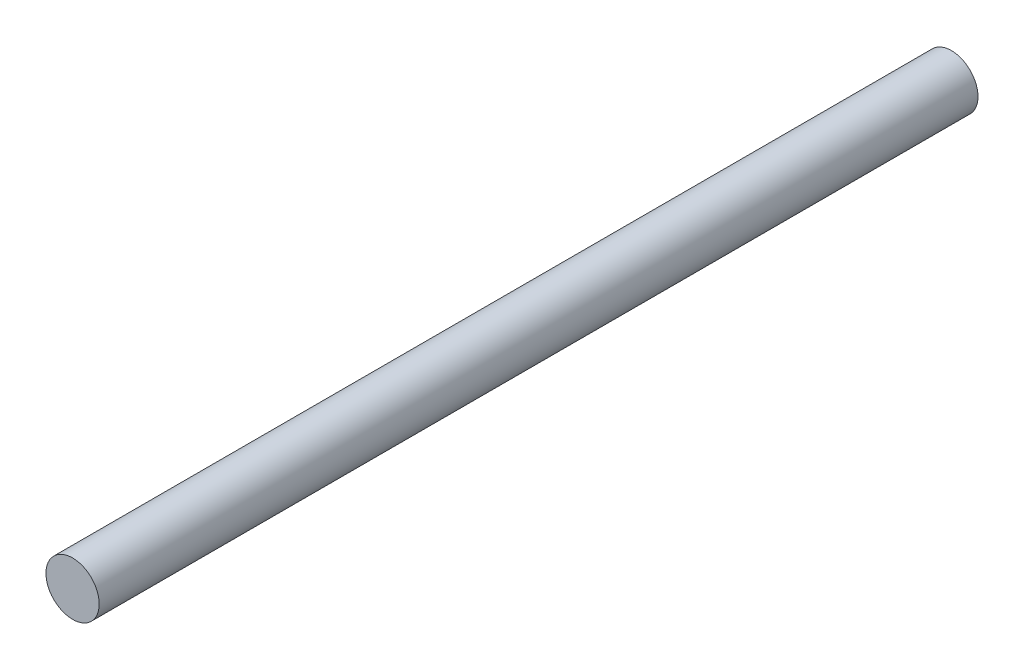
ISO-10303-21;
HEADER;
FILE_DESCRIPTION(('STEP AP214'),'2;1');
FILE_NAME('part.step','',(''),(''),'','','');
FILE_SCHEMA(('AUTOMOTIVE_DESIGN { 1 0 10303 214 1 1 1 1 }'));
ENDSEC;
DATA;
#1=APPLICATION_CONTEXT('core data for automotive mechanical design processes');
#2=APPLICATION_PROTOCOL_DEFINITION('international standard','automotive_design',2000,#1);
#3=PRODUCT_CONTEXT('',#1,'mechanical');
#4=PRODUCT('Part','Part','',(#3));
#5=PRODUCT_RELATED_PRODUCT_CATEGORY('part','',(#4));
#6=PRODUCT_DEFINITION_FORMATION('','',#4);
#7=PRODUCT_DEFINITION_CONTEXT('part definition',#1,'design');
#8=PRODUCT_DEFINITION('design','',#6,#7);
#9=PRODUCT_DEFINITION_SHAPE('','',#8);
#10=(LENGTH_UNIT() NAMED_UNIT(*) SI_UNIT(.MILLI.,.METRE.));
#11=(NAMED_UNIT(*) PLANE_ANGLE_UNIT() SI_UNIT($,.RADIAN.));
#12=(NAMED_UNIT(*) SI_UNIT($,.STERADIAN.) SOLID_ANGLE_UNIT());
#13=UNCERTAINTY_MEASURE_WITH_UNIT(LENGTH_MEASURE(1.E-05),#10,'distance_accuracy_value','');
#14=(GEOMETRIC_REPRESENTATION_CONTEXT(3) GLOBAL_UNCERTAINTY_ASSIGNED_CONTEXT((#13)) GLOBAL_UNIT_ASSIGNED_CONTEXT((#10,
#11,#12)) REPRESENTATION_CONTEXT('',''));
#15=CARTESIAN_POINT('',(0.,0.,0.));
#16=DIRECTION('',(0.,0.,1.));
#17=DIRECTION('',(1.,0.,0.));
#18=AXIS2_PLACEMENT_3D('',#15,#16,#17);
#19=CARTESIAN_POINT('',(0.,0.,66.));
#20=DIRECTION('',(0.,0.,-1.));
#21=DIRECTION('',(-1.,0.,0.));
#22=AXIS2_PLACEMENT_3D('',#19,#20,#21);
#23=CYLINDRICAL_SURFACE('',#22,2.);
#24=CARTESIAN_POINT('',(0.,0.,66.));
#25=DIRECTION('',(0.,0.,1.));
#26=DIRECTION('',(1.,0.,0.));
#27=AXIS2_PLACEMENT_3D('',#24,#25,#26);
#28=CIRCLE('',#27,2.);
#29=CARTESIAN_POINT('',(2.,0.,66.));
#30=VERTEX_POINT('',#29);
#31=EDGE_CURVE('E10',#30,#30,#28,.T.);
#32=ORIENTED_EDGE('',*,*,#31,.F.);
#33=EDGE_LOOP('',(#32));
#34=FACE_BOUND('',#33,.T.);
#35=CARTESIAN_POINT('',(0.,0.,0.));
#36=DIRECTION('',(0.,0.,1.));
#37=DIRECTION('',(1.,0.,0.));
#38=AXIS2_PLACEMENT_3D('',#35,#36,#37);
#39=CIRCLE('',#38,2.);
#40=CARTESIAN_POINT('',(2.,0.,0.));
#41=VERTEX_POINT('',#40);
#42=EDGE_CURVE('E46',#41,#41,#39,.T.);
#43=ORIENTED_EDGE('',*,*,#42,.T.);
#44=EDGE_LOOP('',(#43));
#45=FACE_BOUND('',#44,.T.);
#46=ADVANCED_FACE('F43',(#34,#45),#23,.T.);
#47=CARTESIAN_POINT('',(0.,0.,66.));
#48=DIRECTION('',(0.,0.,1.));
#49=DIRECTION('',(1.,0.,0.));
#50=AXIS2_PLACEMENT_3D('',#47,#48,#49);
#51=PLANE('',#50);
#52=ORIENTED_EDGE('',*,*,#31,.T.);
#53=EDGE_LOOP('',(#52));
#54=FACE_BOUND('',#53,.T.);
#55=ADVANCED_FACE('F58',(#54),#51,.T.);
#56=CARTESIAN_POINT('',(0.,0.,0.));
#57=DIRECTION('',(0.,0.,1.));
#58=DIRECTION('',(1.,0.,0.));
#59=AXIS2_PLACEMENT_3D('',#56,#57,#58);
#60=PLANE('',#59);
#61=ORIENTED_EDGE('',*,*,#42,.F.);
#62=EDGE_LOOP('',(#61));
#63=FACE_BOUND('',#62,.T.);
#64=ADVANCED_FACE('F56',(#63),#60,.F.);
#65=CLOSED_SHELL('',(#46,#55,#64));
#66=MANIFOLD_SOLID_BREP('B2',#65);
#67=ADVANCED_BREP_SHAPE_REPRESENTATION('',(#18,#66),#14);
#68=SHAPE_DEFINITION_REPRESENTATION(#9,#67);
ENDSEC;
END-ISO-10303-21;
